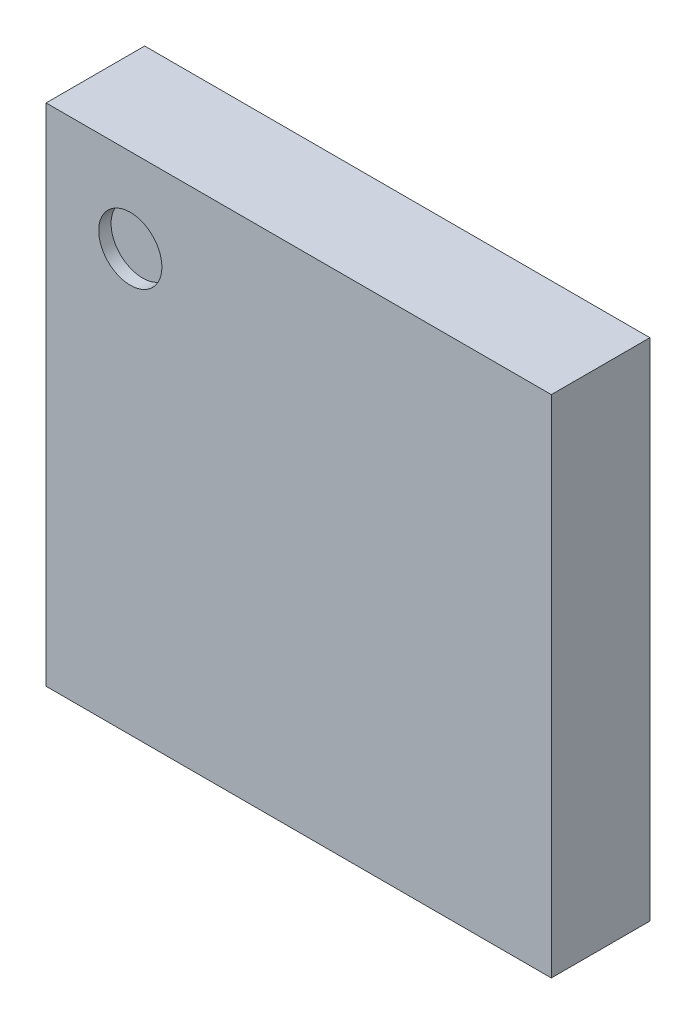
ISO-10303-21;
HEADER;
FILE_DESCRIPTION(('STEP AP214'),'2;1');
FILE_NAME('part.step','',(''),(''),'','','');
FILE_SCHEMA(('AUTOMOTIVE_DESIGN { 1 0 10303 214 1 1 1 1 }'));
ENDSEC;
DATA;
#1=APPLICATION_CONTEXT('core data for automotive mechanical design processes');
#2=APPLICATION_PROTOCOL_DEFINITION('international standard','automotive_design',2000,#1);
#3=PRODUCT_CONTEXT('',#1,'mechanical');
#4=PRODUCT('Part','Part','',(#3));
#5=PRODUCT_RELATED_PRODUCT_CATEGORY('part','',(#4));
#6=PRODUCT_DEFINITION_FORMATION('','',#4);
#7=PRODUCT_DEFINITION_CONTEXT('part definition',#1,'design');
#8=PRODUCT_DEFINITION('design','',#6,#7);
#9=PRODUCT_DEFINITION_SHAPE('','',#8);
#10=(LENGTH_UNIT() NAMED_UNIT(*) SI_UNIT(.MILLI.,.METRE.));
#11=(NAMED_UNIT(*) PLANE_ANGLE_UNIT() SI_UNIT($,.RADIAN.));
#12=(NAMED_UNIT(*) SI_UNIT($,.STERADIAN.) SOLID_ANGLE_UNIT());
#13=UNCERTAINTY_MEASURE_WITH_UNIT(LENGTH_MEASURE(1.E-05),#10,'distance_accuracy_value','');
#14=(GEOMETRIC_REPRESENTATION_CONTEXT(3) GLOBAL_UNCERTAINTY_ASSIGNED_CONTEXT((#13)) GLOBAL_UNIT_ASSIGNED_CONTEXT((#10,
#11,#12)) REPRESENTATION_CONTEXT('',''));
#15=CARTESIAN_POINT('',(0.,0.,0.));
#16=DIRECTION('',(0.,0.,1.));
#17=DIRECTION('',(1.,0.,0.));
#18=AXIS2_PLACEMENT_3D('',#15,#16,#17);
#19=CARTESIAN_POINT('',(0.683333333333,3.416666666667,0.7));
#20=DIRECTION('',(0.,0.,1.));
#21=DIRECTION('',(1.,0.,0.));
#22=AXIS2_PLACEMENT_3D('',#19,#20,#21);
#23=PLANE('',#22);
#24=CARTESIAN_POINT('',(0.683333333333,3.416666666667,0.7));
#25=DIRECTION('',(0.,0.,1.));
#26=DIRECTION('',(1.,0.,0.));
#27=AXIS2_PLACEMENT_3D('',#24,#25,#26);
#28=CIRCLE('',#27,0.25625);
#29=CARTESIAN_POINT('',(0.939583333333,3.416666666667,0.7));
#30=VERTEX_POINT('',#29);
#31=EDGE_CURVE('E20',#30,#30,#28,.T.);
#32=ORIENTED_EDGE('',*,*,#31,.T.);
#33=EDGE_LOOP('',(#32));
#34=FACE_BOUND('',#33,.T.);
#35=ADVANCED_FACE('F17',(#34),#23,.T.);
#36=CARTESIAN_POINT('',(0.683333333333,3.416666666667,0.7));
#37=DIRECTION('',(0.,0.,1.));
#38=DIRECTION('',(1.,0.,0.));
#39=AXIS2_PLACEMENT_3D('',#36,#37,#38);
#40=CYLINDRICAL_SURFACE('',#39,0.25625);
#41=CARTESIAN_POINT('',(0.683333333333,3.416666666667,0.8));
#42=DIRECTION('',(0.,0.,1.));
#43=DIRECTION('',(1.,0.,0.));
#44=AXIS2_PLACEMENT_3D('',#41,#42,#43);
#45=CIRCLE('',#44,0.25625);
#46=CARTESIAN_POINT('',(0.939583333333,3.416666666667,0.8));
#47=VERTEX_POINT('',#46);
#48=EDGE_CURVE('E66',#47,#47,#45,.F.);
#49=ORIENTED_EDGE('',*,*,#48,.F.);
#50=EDGE_LOOP('',(#49));
#51=FACE_BOUND('',#50,.T.);
#52=ORIENTED_EDGE('',*,*,#31,.F.);
#53=EDGE_LOOP('',(#52));
#54=FACE_BOUND('',#53,.T.);
#55=ADVANCED_FACE('F87',(#51,#54),#40,.F.);
#56=CARTESIAN_POINT('',(0.,0.,0.8));
#57=DIRECTION('',(0.,0.,1.));
#58=DIRECTION('',(1.,0.,0.));
#59=AXIS2_PLACEMENT_3D('',#56,#57,#58);
#60=PLANE('',#59);
#61=ORIENTED_EDGE('',*,*,#48,.T.);
#62=EDGE_LOOP('',(#61));
#63=FACE_BOUND('',#62,.T.);
#64=DIRECTION('',(0.,1.,0.));
#65=VECTOR('',#64,1.);
#66=CARTESIAN_POINT('',(4.1,0.,0.8));
#67=LINE('',#66,#65);
#68=CARTESIAN_POINT('',(4.1,4.1,0.8));
#69=VERTEX_POINT('',#68);
#70=CARTESIAN_POINT('',(4.1,0.,0.8));
#71=VERTEX_POINT('',#70);
#72=EDGE_CURVE('E166',#69,#71,#67,.F.);
#73=ORIENTED_EDGE('',*,*,#72,.F.);
#74=DIRECTION('',(1.,0.,0.));
#75=VECTOR('',#74,1.);
#76=CARTESIAN_POINT('',(0.,4.1,0.8));
#77=LINE('',#76,#75);
#78=CARTESIAN_POINT('',(0.,4.1,0.8));
#79=VERTEX_POINT('',#78);
#80=EDGE_CURVE('E60',#79,#69,#77,.T.);
#81=ORIENTED_EDGE('',*,*,#80,.F.);
#82=DIRECTION('',(0.,1.,0.));
#83=VECTOR('',#82,1.);
#84=CARTESIAN_POINT('',(0.,0.,0.8));
#85=LINE('',#84,#83);
#86=CARTESIAN_POINT('',(0.,0.,0.8));
#87=VERTEX_POINT('',#86);
#88=EDGE_CURVE('E58',#79,#87,#85,.F.);
#89=ORIENTED_EDGE('',*,*,#88,.T.);
#90=DIRECTION('',(1.,0.,0.));
#91=VECTOR('',#90,1.);
#92=CARTESIAN_POINT('',(0.,0.,0.8));
#93=LINE('',#92,#91);
#94=EDGE_CURVE('E55',#87,#71,#93,.T.);
#95=ORIENTED_EDGE('',*,*,#94,.T.);
#96=EDGE_LOOP('',(#73,#81,#89,#95));
#97=FACE_BOUND('',#96,.T.);
#98=ADVANCED_FACE('F59',(#63,#97),#60,.T.);
#99=CARTESIAN_POINT('',(0.,0.,0.));
#100=DIRECTION('',(1.,0.,0.));
#101=DIRECTION('',(0.,0.,-1.));
#102=AXIS2_PLACEMENT_3D('',#99,#100,#101);
#103=PLANE('',#102);
#104=DIRECTION('',(0.,0.,1.));
#105=VECTOR('',#104,1.);
#106=CARTESIAN_POINT('',(0.,4.1,0.));
#107=LINE('',#106,#105);
#108=CARTESIAN_POINT('',(0.,4.1,0.));
#109=VERTEX_POINT('',#108);
#110=EDGE_CURVE('E170',#109,#79,#107,.T.);
#111=ORIENTED_EDGE('',*,*,#110,.F.);
#112=DIRECTION('',(0.,1.,0.));
#113=VECTOR('',#112,1.);
#114=CARTESIAN_POINT('',(0.,0.,0.));
#115=LINE('',#114,#113);
#116=CARTESIAN_POINT('',(0.,0.,0.));
#117=VERTEX_POINT('',#116);
#118=EDGE_CURVE('E77',#109,#117,#115,.F.);
#119=ORIENTED_EDGE('',*,*,#118,.T.);
#120=DIRECTION('',(0.,0.,1.));
#121=VECTOR('',#120,1.);
#122=CARTESIAN_POINT('',(0.,0.,0.));
#123=LINE('',#122,#121);
#124=EDGE_CURVE('E65',#117,#87,#123,.T.);
#125=ORIENTED_EDGE('',*,*,#124,.T.);
#126=ORIENTED_EDGE('',*,*,#88,.F.);
#127=EDGE_LOOP('',(#111,#119,#125,#126));
#128=FACE_BOUND('',#127,.T.);
#129=ADVANCED_FACE('F76',(#128),#103,.F.);
#130=CARTESIAN_POINT('',(0.,0.,0.));
#131=DIRECTION('',(0.,1.,0.));
#132=DIRECTION('',(0.,0.,1.));
#133=AXIS2_PLACEMENT_3D('',#130,#131,#132);
#134=PLANE('',#133);
#135=ORIENTED_EDGE('',*,*,#94,.F.);
#136=ORIENTED_EDGE('',*,*,#124,.F.);
#137=DIRECTION('',(1.,0.,0.));
#138=VECTOR('',#137,1.);
#139=CARTESIAN_POINT('',(0.,0.,0.));
#140=LINE('',#139,#138);
#141=CARTESIAN_POINT('',(4.1,0.,0.));
#142=VERTEX_POINT('',#141);
#143=EDGE_CURVE('E168',#117,#142,#140,.T.);
#144=ORIENTED_EDGE('',*,*,#143,.T.);
#145=DIRECTION('',(0.,0.,-1.));
#146=VECTOR('',#145,1.);
#147=CARTESIAN_POINT('',(4.1,0.,0.));
#148=LINE('',#147,#146);
#149=EDGE_CURVE('E73',#71,#142,#148,.T.);
#150=ORIENTED_EDGE('',*,*,#149,.F.);
#151=EDGE_LOOP('',(#135,#136,#144,#150));
#152=FACE_BOUND('',#151,.T.);
#153=ADVANCED_FACE('F70',(#152),#134,.F.);
#154=CARTESIAN_POINT('',(4.1,0.,0.));
#155=DIRECTION('',(1.,0.,0.));
#156=DIRECTION('',(0.,0.,-1.));
#157=AXIS2_PLACEMENT_3D('',#154,#155,#156);
#158=PLANE('',#157);
#159=DIRECTION('',(0.,0.,1.));
#160=VECTOR('',#159,1.);
#161=CARTESIAN_POINT('',(4.1,4.1,0.));
#162=LINE('',#161,#160);
#163=CARTESIAN_POINT('',(4.1,4.1,0.));
#164=VERTEX_POINT('',#163);
#165=EDGE_CURVE('E34',#69,#164,#162,.F.);
#166=ORIENTED_EDGE('',*,*,#165,.F.);
#167=ORIENTED_EDGE('',*,*,#72,.T.);
#168=ORIENTED_EDGE('',*,*,#149,.T.);
#169=DIRECTION('',(0.,1.,0.));
#170=VECTOR('',#169,1.);
#171=CARTESIAN_POINT('',(4.1,0.,0.));
#172=LINE('',#171,#170);
#173=EDGE_CURVE('E26',#142,#164,#172,.T.);
#174=ORIENTED_EDGE('',*,*,#173,.T.);
#175=EDGE_LOOP('',(#166,#167,#168,#174));
#176=FACE_BOUND('',#175,.T.);
#177=ADVANCED_FACE('F104',(#176),#158,.T.);
#178=CARTESIAN_POINT('',(0.,4.1,0.));
#179=DIRECTION('',(0.,1.,0.));
#180=DIRECTION('',(0.,0.,1.));
#181=AXIS2_PLACEMENT_3D('',#178,#179,#180);
#182=PLANE('',#181);
#183=ORIENTED_EDGE('',*,*,#80,.T.);
#184=ORIENTED_EDGE('',*,*,#165,.T.);
#185=DIRECTION('',(1.,0.,0.));
#186=VECTOR('',#185,1.);
#187=CARTESIAN_POINT('',(0.,4.1,0.));
#188=LINE('',#187,#186);
#189=EDGE_CURVE('E11',#164,#109,#188,.F.);
#190=ORIENTED_EDGE('',*,*,#189,.T.);
#191=ORIENTED_EDGE('',*,*,#110,.T.);
#192=EDGE_LOOP('',(#183,#184,#190,#191));
#193=FACE_BOUND('',#192,.T.);
#194=ADVANCED_FACE('F98',(#193),#182,.T.);
#195=CARTESIAN_POINT('',(0.,0.,0.));
#196=DIRECTION('',(0.,0.,1.));
#197=DIRECTION('',(1.,0.,0.));
#198=AXIS2_PLACEMENT_3D('',#195,#196,#197);
#199=PLANE('',#198);
#200=ORIENTED_EDGE('',*,*,#173,.F.);
#201=ORIENTED_EDGE('',*,*,#143,.F.);
#202=ORIENTED_EDGE('',*,*,#118,.F.);
#203=ORIENTED_EDGE('',*,*,#189,.F.);
#204=EDGE_LOOP('',(#200,#201,#202,#203));
#205=FACE_BOUND('',#204,.T.);
#206=ADVANCED_FACE('F96',(#205),#199,.F.);
#207=CLOSED_SHELL('',(#35,#55,#98,#129,#153,#177,#194,#206));
#208=MANIFOLD_SOLID_BREP('B1',#207);
#209=ADVANCED_BREP_SHAPE_REPRESENTATION('',(#18,#208),#14);
#210=SHAPE_DEFINITION_REPRESENTATION(#9,#209);
ENDSEC;
END-ISO-10303-21;
